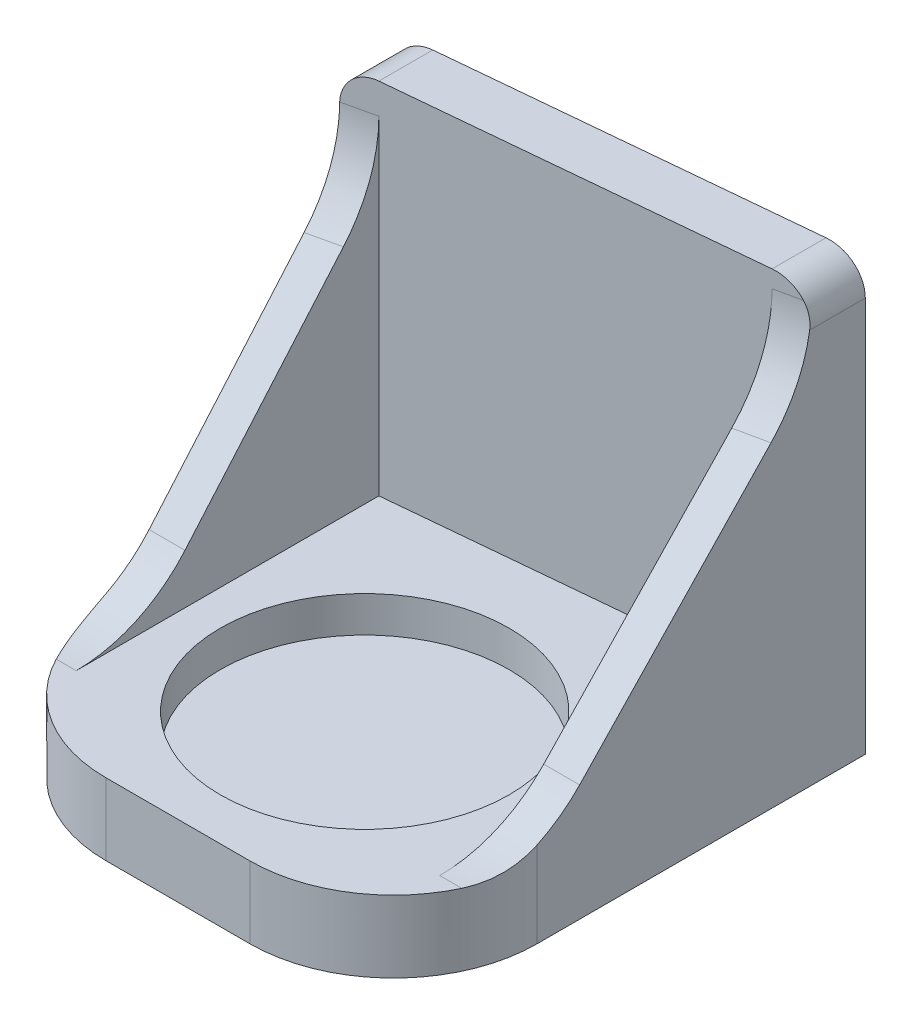
ISO-10303-21;
HEADER;
FILE_DESCRIPTION(('STEP AP214'),'2;1');
FILE_NAME('part.step','',(''),(''),'','','');
FILE_SCHEMA(('AUTOMOTIVE_DESIGN { 1 0 10303 214 1 1 1 1 }'));
ENDSEC;
DATA;
#1=APPLICATION_CONTEXT('core data for automotive mechanical design processes');
#2=APPLICATION_PROTOCOL_DEFINITION('international standard','automotive_design',2000,#1);
#3=PRODUCT_CONTEXT('',#1,'mechanical');
#4=PRODUCT('Part','Part','',(#3));
#5=PRODUCT_RELATED_PRODUCT_CATEGORY('part','',(#4));
#6=PRODUCT_DEFINITION_FORMATION('','',#4);
#7=PRODUCT_DEFINITION_CONTEXT('part definition',#1,'design');
#8=PRODUCT_DEFINITION('design','',#6,#7);
#9=PRODUCT_DEFINITION_SHAPE('','',#8);
#10=(LENGTH_UNIT() NAMED_UNIT(*) SI_UNIT(.MILLI.,.METRE.));
#11=(NAMED_UNIT(*) PLANE_ANGLE_UNIT() SI_UNIT($,.RADIAN.));
#12=(NAMED_UNIT(*) SI_UNIT($,.STERADIAN.) SOLID_ANGLE_UNIT());
#13=UNCERTAINTY_MEASURE_WITH_UNIT(LENGTH_MEASURE(1.E-05),#10,'distance_accuracy_value','');
#14=(GEOMETRIC_REPRESENTATION_CONTEXT(3) GLOBAL_UNCERTAINTY_ASSIGNED_CONTEXT((#13)) GLOBAL_UNIT_ASSIGNED_CONTEXT((#10,
#11,#12)) REPRESENTATION_CONTEXT('',''));
#15=CARTESIAN_POINT('',(0.,0.,0.));
#16=DIRECTION('',(0.,0.,1.));
#17=DIRECTION('',(1.,0.,0.));
#18=AXIS2_PLACEMENT_3D('',#15,#16,#17);
#19=CARTESIAN_POINT('',(19.05,6.35,-22.6515103679304));
#20=DIRECTION('',(0.0941083133185078,0.,0.995561964603081));
#21=DIRECTION('',(0.995561964603081,0.,-0.0941083133185078));
#22=AXIS2_PLACEMENT_3D('',#19,#20,#21);
#23=PLANE('',#22);
#24=DIRECTION('',(-0.99556196460308,0.,0.0941083133185077));
#25=VECTOR('',#24,1.);
#26=CARTESIAN_POINT('',(19.05,38.1,-22.6515103679304));
#27=LINE('',#26,#25);
#28=CARTESIAN_POINT('',(15.875,38.1,-22.3513845039362));
#29=VERTEX_POINT('',#28);
#30=CARTESIAN_POINT('',(-15.875,38.1,-19.3501258639942));
#31=VERTEX_POINT('',#30);
#32=EDGE_CURVE('E167',#29,#31,#27,.T.);
#33=ORIENTED_EDGE('',*,*,#32,.F.);
#34=CARTESIAN_POINT('',(15.875,34.925,-22.3513845039362));
#35=DIRECTION('',(0.0941083133185078,0.,0.995561964603081));
#36=DIRECTION('',(-0.995561964603081,0.,0.0941083133185078));
#37=AXIS2_PLACEMENT_3D('',#34,#35,#36);
#38=ELLIPSE('',#37,3.18915357645853,3.175);
#39=CARTESIAN_POINT('',(19.05,34.925,-22.6515103679304));
#40=VERTEX_POINT('',#39);
#41=EDGE_CURVE('E341',#29,#40,#38,.F.);
#42=ORIENTED_EDGE('',*,*,#41,.T.);
#43=DIRECTION('',(0.,-1.,0.));
#44=VECTOR('',#43,1.);
#45=CARTESIAN_POINT('',(19.05,6.35,-22.6515103679304));
#46=LINE('',#45,#44);
#47=CARTESIAN_POINT('',(19.05,0.,-22.6515103679304));
#48=VERTEX_POINT('',#47);
#49=EDGE_CURVE('E212',#40,#48,#46,.T.);
#50=ORIENTED_EDGE('',*,*,#49,.T.);
#51=DIRECTION('',(-0.99556196460308,0.,0.0941083133185077));
#52=VECTOR('',#51,1.);
#53=CARTESIAN_POINT('',(19.05,0.,-22.6515103679304));
#54=LINE('',#53,#52);
#55=CARTESIAN_POINT('',(-19.05,0.,-19.05));
#56=VERTEX_POINT('',#55);
#57=EDGE_CURVE('E206',#48,#56,#54,.T.);
#58=ORIENTED_EDGE('',*,*,#57,.T.);
#59=DIRECTION('',(0.,-1.,0.));
#60=VECTOR('',#59,1.);
#61=CARTESIAN_POINT('',(-19.05,6.35,-19.05));
#62=LINE('',#61,#60);
#63=CARTESIAN_POINT('',(-19.05,34.925,-19.05));
#64=VERTEX_POINT('',#63);
#65=EDGE_CURVE('E225',#64,#56,#62,.T.);
#66=ORIENTED_EDGE('',*,*,#65,.F.);
#67=CARTESIAN_POINT('',(-15.875,34.925,-19.3501258639942));
#68=DIRECTION('',(0.0941083133185078,0.,0.995561964603081));
#69=DIRECTION('',(0.995561964603081,0.,-0.0941083133185078));
#70=AXIS2_PLACEMENT_3D('',#67,#68,#69);
#71=ELLIPSE('',#70,3.18915357645853,3.175);
#72=EDGE_CURVE('E345',#64,#31,#71,.F.);
#73=ORIENTED_EDGE('',*,*,#72,.T.);
#74=EDGE_LOOP('',(#33,#42,#50,#58,#66,#73));
#75=FACE_BOUND('',#74,.T.);
#76=ADVANCED_FACE('F33',(#75),#23,.F.);
#77=CARTESIAN_POINT('',(-19.05,6.35,-19.05));
#78=DIRECTION('',(1.,0.,0.));
#79=DIRECTION('',(0.,0.,-1.));
#80=AXIS2_PLACEMENT_3D('',#77,#78,#79);
#81=PLANE('',#80);
#82=CARTESIAN_POINT('',(-19.05,34.9321798310049,-1.53088569416586));
#83=DIRECTION('',(1.,0.,0.));
#84=DIRECTION('',(0.,0.757248519517734,-0.653126848084046));
#85=AXIS2_PLACEMENT_3D('',#82,#83,#84);
#86=ELLIPSE('',#85,12.8323248452112,12.7);
#87=CARTESIAN_POINT('',(-19.05,26.6374688603375,-11.1479418920411));
#88=VERTEX_POINT('',#87);
#89=CARTESIAN_POINT('',(-19.05,34.925,-14.2867540013075));
#90=VERTEX_POINT('',#89);
#91=EDGE_CURVE('E354',#88,#90,#86,.T.);
#92=ORIENTED_EDGE('',*,*,#91,.T.);
#93=DIRECTION('',(0.,0.,1.));
#94=VECTOR('',#93,1.);
#95=CARTESIAN_POINT('',(-19.05,34.925,-19.05));
#96=LINE('',#95,#94);
#97=EDGE_CURVE('E11',#90,#64,#96,.F.);
#98=ORIENTED_EDGE('',*,*,#97,.T.);
#99=ORIENTED_EDGE('',*,*,#65,.T.);
#100=DIRECTION('',(0.,0.,1.));
#101=VECTOR('',#100,1.);
#102=CARTESIAN_POINT('',(-19.05,0.,-19.05));
#103=LINE('',#102,#101);
#104=CARTESIAN_POINT('',(-19.05,0.,6.35));
#105=VERTEX_POINT('',#104);
#106=EDGE_CURVE('E216',#56,#105,#103,.T.);
#107=ORIENTED_EDGE('',*,*,#106,.T.);
#108=DIRECTION('',(0.,-1.,0.));
#109=VECTOR('',#108,1.);
#110=CARTESIAN_POINT('',(-19.05,6.35,6.35));
#111=LINE('',#110,#109);
#112=CARTESIAN_POINT('',(-19.05,7.76076801599256,6.35));
#113=VERTEX_POINT('',#112);
#114=EDGE_CURVE('E178',#105,#113,#111,.F.);
#115=ORIENTED_EDGE('',*,*,#114,.T.);
#116=CARTESIAN_POINT('',(-19.05,19.05,12.1674944100758));
#117=DIRECTION('',(1.,0.,0.));
#118=DIRECTION('',(0.,0.,-1.));
#119=AXIS2_PLACEMENT_3D('',#116,#117,#118);
#120=CIRCLE('',#119,12.7);
#121=CARTESIAN_POINT('',(-19.05,10.7552890293326,2.55043821220062));
#122=VERTEX_POINT('',#121);
#123=EDGE_CURVE('E297',#113,#122,#120,.T.);
#124=ORIENTED_EDGE('',*,*,#123,.T.);
#125=DIRECTION('',(0.,0.757248519517734,-0.653126848084046));
#126=VECTOR('',#125,1.);
#127=CARTESIAN_POINT('',(-19.05,31.75,-15.5575));
#128=LINE('',#127,#126);
#129=EDGE_CURVE('E194',#122,#88,#128,.T.);
#130=ORIENTED_EDGE('',*,*,#129,.T.);
#131=EDGE_LOOP('',(#92,#98,#99,#107,#115,#124,#130));
#132=FACE_BOUND('',#131,.T.);
#133=ADVANCED_FACE('F333',(#132),#81,.F.);
#134=CARTESIAN_POINT('',(-19.05,6.35,19.05));
#135=DIRECTION('',(0.,0.,-1.));
#136=DIRECTION('',(-1.,0.,0.));
#137=AXIS2_PLACEMENT_3D('',#134,#135,#136);
#138=PLANE('',#137);
#139=DIRECTION('',(1.,0.,0.));
#140=VECTOR('',#139,1.);
#141=CARTESIAN_POINT('',(-19.05,0.,19.05));
#142=LINE('',#141,#140);
#143=CARTESIAN_POINT('',(-6.35000000000001,0.,19.05));
#144=VERTEX_POINT('',#143);
#145=CARTESIAN_POINT('',(6.34999999999999,0.,19.05));
#146=VERTEX_POINT('',#145);
#147=EDGE_CURVE('E219',#144,#146,#142,.T.);
#148=ORIENTED_EDGE('',*,*,#147,.T.);
#149=DIRECTION('',(0.,-1.,0.));
#150=VECTOR('',#149,1.);
#151=CARTESIAN_POINT('',(6.35,6.35,19.05));
#152=LINE('',#151,#150);
#153=CARTESIAN_POINT('',(6.34999999999999,6.35,19.05));
#154=VERTEX_POINT('',#153);
#155=EDGE_CURVE('E237',#146,#154,#152,.F.);
#156=ORIENTED_EDGE('',*,*,#155,.T.);
#157=DIRECTION('',(1.,0.,0.));
#158=VECTOR('',#157,1.);
#159=CARTESIAN_POINT('',(-19.05,6.35,19.05));
#160=LINE('',#159,#158);
#161=CARTESIAN_POINT('',(-6.35000000000001,6.35,19.05));
#162=VERTEX_POINT('',#161);
#163=EDGE_CURVE('E209',#162,#154,#160,.T.);
#164=ORIENTED_EDGE('',*,*,#163,.F.);
#165=DIRECTION('',(0.,-1.,0.));
#166=VECTOR('',#165,1.);
#167=CARTESIAN_POINT('',(-6.35,6.35,19.05));
#168=LINE('',#167,#166);
#169=EDGE_CURVE('E234',#162,#144,#168,.T.);
#170=ORIENTED_EDGE('',*,*,#169,.T.);
#171=EDGE_LOOP('',(#148,#156,#164,#170));
#172=FACE_BOUND('',#171,.T.);
#173=ADVANCED_FACE('F338',(#172),#138,.F.);
#174=CARTESIAN_POINT('',(19.05,6.35,19.05));
#175=DIRECTION('',(-1.,0.,0.));
#176=DIRECTION('',(0.,0.,1.));
#177=AXIS2_PLACEMENT_3D('',#174,#175,#176);
#178=PLANE('',#177);
#179=ORIENTED_EDGE('',*,*,#49,.F.);
#180=DIRECTION('',(0.,0.,-1.));
#181=VECTOR('',#180,1.);
#182=CARTESIAN_POINT('',(19.05,34.925,-17.8890103679304));
#183=LINE('',#182,#181);
#184=CARTESIAN_POINT('',(19.05,34.925,-17.7360967193134));
#185=VERTEX_POINT('',#184);
#186=EDGE_CURVE('E319',#40,#185,#183,.F.);
#187=ORIENTED_EDGE('',*,*,#186,.T.);
#188=CARTESIAN_POINT('',(19.05,36.778048987197,-5.13239606209626));
#189=DIRECTION('',(-1.,0.,0.));
#190=DIRECTION('',(0.,0.72344721064674,-0.690379702343176));
#191=AXIS2_PLACEMENT_3D('',#188,#189,#190);
#192=ELLIPSE('',#191,12.8184938370346,12.7);
#193=CARTESIAN_POINT('',(19.05,28.0102267674387,-14.3201756373098));
#194=VERTEX_POINT('',#193);
#195=EDGE_CURVE('E365',#185,#194,#192,.T.);
#196=ORIENTED_EDGE('',*,*,#195,.T.);
#197=DIRECTION('',(0.,-0.72344721064674,0.690379702343175));
#198=VECTOR('',#197,1.);
#199=CARTESIAN_POINT('',(19.05,6.35,6.35));
#200=LINE('',#199,#198);
#201=CARTESIAN_POINT('',(19.05,10.2821777802417,2.59755519748727));
#202=VERTEX_POINT('',#201);
#203=EDGE_CURVE('E186',#194,#202,#200,.T.);
#204=ORIENTED_EDGE('',*,*,#203,.T.);
#205=CARTESIAN_POINT('',(19.05,19.05,11.7853347727009));
#206=DIRECTION('',(-1.,0.,0.));
#207=DIRECTION('',(0.,0.,1.));
#208=AXIS2_PLACEMENT_3D('',#205,#206,#207);
#209=CIRCLE('',#208,12.7);
#210=CARTESIAN_POINT('',(19.05,7.57188447920701,6.35));
#211=VERTEX_POINT('',#210);
#212=EDGE_CURVE('E262',#202,#211,#209,.T.);
#213=ORIENTED_EDGE('',*,*,#212,.T.);
#214=DIRECTION('',(0.,-1.,0.));
#215=VECTOR('',#214,1.);
#216=CARTESIAN_POINT('',(19.05,6.35,6.35));
#217=LINE('',#216,#215);
#218=CARTESIAN_POINT('',(19.05,0.,6.35));
#219=VERTEX_POINT('',#218);
#220=EDGE_CURVE('E227',#211,#219,#217,.T.);
#221=ORIENTED_EDGE('',*,*,#220,.T.);
#222=DIRECTION('',(0.,0.,-1.));
#223=VECTOR('',#222,1.);
#224=CARTESIAN_POINT('',(19.05,0.,19.05));
#225=LINE('',#224,#223);
#226=EDGE_CURVE('E213',#219,#48,#225,.T.);
#227=ORIENTED_EDGE('',*,*,#226,.T.);
#228=EDGE_LOOP('',(#179,#187,#196,#204,#213,#221,#227));
#229=FACE_BOUND('',#228,.T.);
#230=ADVANCED_FACE('F364',(#229),#178,.F.);
#231=CARTESIAN_POINT('',(0.,6.35,0.));
#232=DIRECTION('',(0.,1.,0.));
#233=DIRECTION('',(0.,0.,1.));
#234=AXIS2_PLACEMENT_3D('',#231,#232,#233);
#235=PLANE('',#234);
#236=CARTESIAN_POINT('',(6.35,6.35,6.35));
#237=DIRECTION('',(0.,1.,0.));
#238=DIRECTION('',(0.,0.,1.));
#239=AXIS2_PLACEMENT_3D('',#236,#237,#238);
#240=CIRCLE('',#239,12.7);
#241=CARTESIAN_POINT('',(17.828115520793,6.35,11.7853347727009));
#242=VERTEX_POINT('',#241);
#243=EDGE_CURVE('E241',#154,#242,#240,.T.);
#244=ORIENTED_EDGE('',*,*,#243,.T.);
#245=DIRECTION('',(1.,0.,0.));
#246=VECTOR('',#245,1.);
#247=CARTESIAN_POINT('',(15.875,6.35,11.7853347727009));
#248=LINE('',#247,#246);
#249=CARTESIAN_POINT('',(15.875,6.35,11.7853347727009));
#250=VERTEX_POINT('',#249);
#251=EDGE_CURVE('E184',#242,#250,#248,.F.);
#252=ORIENTED_EDGE('',*,*,#251,.T.);
#253=DIRECTION('',(0.,0.,-1.));
#254=VECTOR('',#253,1.);
#255=CARTESIAN_POINT('',(15.875,6.35,-17.8890103679304));
#256=LINE('',#255,#254);
#257=CARTESIAN_POINT('',(15.875,6.35,-17.5888845039362));
#258=VERTEX_POINT('',#257);
#259=EDGE_CURVE('E173',#250,#258,#256,.T.);
#260=ORIENTED_EDGE('',*,*,#259,.T.);
#261=DIRECTION('',(0.99556196460308,0.,-0.0941083133185079));
#262=VECTOR('',#261,1.);
#263=CARTESIAN_POINT('',(-19.05,6.35,-14.2875));
#264=LINE('',#263,#262);
#265=CARTESIAN_POINT('',(-15.875,6.35,-14.5876258639942));
#266=VERTEX_POINT('',#265);
#267=EDGE_CURVE('E156',#266,#258,#264,.T.);
#268=ORIENTED_EDGE('',*,*,#267,.F.);
#269=DIRECTION('',(0.,0.,1.));
#270=VECTOR('',#269,1.);
#271=CARTESIAN_POINT('',(-15.875,6.35,6.35));
#272=LINE('',#271,#270);
#273=CARTESIAN_POINT('',(-15.875,6.35,12.1674944100758));
#274=VERTEX_POINT('',#273);
#275=EDGE_CURVE('E391',#266,#274,#272,.T.);
#276=ORIENTED_EDGE('',*,*,#275,.T.);
#277=DIRECTION('',(-1.,0.,0.));
#278=VECTOR('',#277,1.);
#279=CARTESIAN_POINT('',(-19.05,6.35,12.1674944100758));
#280=LINE('',#279,#278);
#281=CARTESIAN_POINT('',(-17.6392319840074,6.35,12.1674944100758));
#282=VERTEX_POINT('',#281);
#283=EDGE_CURVE('E250',#274,#282,#280,.T.);
#284=ORIENTED_EDGE('',*,*,#283,.T.);
#285=CARTESIAN_POINT('',(-6.35,6.35,6.35));
#286=DIRECTION('',(0.,1.,0.));
#287=DIRECTION('',(0.,0.,1.));
#288=AXIS2_PLACEMENT_3D('',#285,#286,#287);
#289=CIRCLE('',#288,12.7);
#290=EDGE_CURVE('E239',#282,#162,#289,.T.);
#291=ORIENTED_EDGE('',*,*,#290,.T.);
#292=ORIENTED_EDGE('',*,*,#163,.T.);
#293=EDGE_LOOP('',(#244,#252,#260,#268,#276,#284,#291,#292));
#294=FACE_BOUND('',#293,.T.);
#295=CARTESIAN_POINT('',(0.,6.35,2.54));
#296=DIRECTION('',(0.,1.,0.));
#297=DIRECTION('',(0.,0.,1.));
#298=AXIS2_PLACEMENT_3D('',#295,#296,#297);
#299=CIRCLE('',#298,12.7635);
#300=CARTESIAN_POINT('',(0.,6.35,15.3035));
#301=VERTEX_POINT('',#300);
#302=EDGE_CURVE('E201',#301,#301,#299,.T.);
#303=ORIENTED_EDGE('',*,*,#302,.F.);
#304=EDGE_LOOP('',(#303));
#305=FACE_BOUND('',#304,.T.);
#306=ADVANCED_FACE('F181',(#294,#305),#235,.T.);
#307=CARTESIAN_POINT('',(0.,0.,0.));
#308=DIRECTION('',(0.,1.,0.));
#309=DIRECTION('',(0.,0.,1.));
#310=AXIS2_PLACEMENT_3D('',#307,#308,#309);
#311=PLANE('',#310);
#312=ORIENTED_EDGE('',*,*,#226,.F.);
#313=CARTESIAN_POINT('',(6.35,0.,6.35));
#314=DIRECTION('',(0.,1.,0.));
#315=DIRECTION('',(0.,0.,1.));
#316=AXIS2_PLACEMENT_3D('',#313,#314,#315);
#317=CIRCLE('',#316,12.7);
#318=EDGE_CURVE('E232',#219,#146,#317,.F.);
#319=ORIENTED_EDGE('',*,*,#318,.T.);
#320=ORIENTED_EDGE('',*,*,#147,.F.);
#321=CARTESIAN_POINT('',(-6.35,0.,6.35));
#322=DIRECTION('',(0.,1.,0.));
#323=DIRECTION('',(0.,0.,1.));
#324=AXIS2_PLACEMENT_3D('',#321,#322,#323);
#325=CIRCLE('',#324,12.7);
#326=EDGE_CURVE('E230',#144,#105,#325,.F.);
#327=ORIENTED_EDGE('',*,*,#326,.T.);
#328=ORIENTED_EDGE('',*,*,#106,.F.);
#329=ORIENTED_EDGE('',*,*,#57,.F.);
#330=EDGE_LOOP('',(#312,#319,#320,#327,#328,#329));
#331=FACE_BOUND('',#330,.T.);
#332=ADVANCED_FACE('F400',(#331),#311,.F.);
#333=CARTESIAN_POINT('',(0.,3.175,2.54));
#334=DIRECTION('',(0.,1.,0.));
#335=DIRECTION('',(0.,0.,1.));
#336=AXIS2_PLACEMENT_3D('',#333,#334,#335);
#337=CYLINDRICAL_SURFACE('',#336,12.7635);
#338=CARTESIAN_POINT('',(0.,3.175,2.54));
#339=DIRECTION('',(0.,1.,0.));
#340=DIRECTION('',(0.,0.,1.));
#341=AXIS2_PLACEMENT_3D('',#338,#339,#340);
#342=CIRCLE('',#341,12.7635);
#343=CARTESIAN_POINT('',(0.,3.175,15.3035));
#344=VERTEX_POINT('',#343);
#345=EDGE_CURVE('E203',#344,#344,#342,.T.);
#346=ORIENTED_EDGE('',*,*,#345,.F.);
#347=EDGE_LOOP('',(#346));
#348=FACE_BOUND('',#347,.T.);
#349=ORIENTED_EDGE('',*,*,#302,.T.);
#350=EDGE_LOOP('',(#349));
#351=FACE_BOUND('',#350,.T.);
#352=ADVANCED_FACE('F427',(#348,#351),#337,.F.);
#353=CARTESIAN_POINT('',(0.,3.175,2.54));
#354=DIRECTION('',(0.,1.,0.));
#355=DIRECTION('',(0.,0.,1.));
#356=AXIS2_PLACEMENT_3D('',#353,#354,#355);
#357=PLANE('',#356);
#358=ORIENTED_EDGE('',*,*,#345,.T.);
#359=EDGE_LOOP('',(#358));
#360=FACE_BOUND('',#359,.T.);
#361=ADVANCED_FACE('F424',(#360),#357,.T.);
#362=CARTESIAN_POINT('',(-19.05,38.1,-14.2875));
#363=DIRECTION('',(-0.0941083133185079,0.,-0.995561964603081));
#364=DIRECTION('',(-0.995561964603081,0.,0.0941083133185079));
#365=AXIS2_PLACEMENT_3D('',#362,#363,#364);
#366=PLANE('',#365);
#367=DIRECTION('',(0.990756024963537,0.0981398179170067,-0.0936540182676033));
#368=VECTOR('',#367,1.);
#369=CARTESIAN_POINT('',(-18.5660172384416,33.1703648765109,-14.3332498407783));
#370=LINE('',#369,#368);
#371=CARTESIAN_POINT('',(15.875,36.5819365202781,-17.5888845039362));
#372=VERTEX_POINT('',#371);
#373=CARTESIAN_POINT('',(18.4125272770952,36.8332925137405,-17.8287514539983));
#374=VERTEX_POINT('',#373);
#375=EDGE_CURVE('E260',#372,#374,#370,.T.);
#376=ORIENTED_EDGE('',*,*,#375,.T.);
#377=CARTESIAN_POINT('',(15.875,34.925,-17.5888845039362));
#378=DIRECTION('',(-0.0941083133185079,0.,-0.995561964603081));
#379=DIRECTION('',(-0.995561964603081,0.,0.0941083133185079));
#380=AXIS2_PLACEMENT_3D('',#377,#378,#379);
#381=ELLIPSE('',#380,3.18915357645854,3.175);
#382=CARTESIAN_POINT('',(15.875,38.1,-17.5888845039362));
#383=VERTEX_POINT('',#382);
#384=EDGE_CURVE('E371',#374,#383,#381,.F.);
#385=ORIENTED_EDGE('',*,*,#384,.T.);
#386=DIRECTION('',(0.99556196460308,0.,-0.0941083133185079));
#387=VECTOR('',#386,1.);
#388=CARTESIAN_POINT('',(-19.05,38.1,-14.2875));
#389=LINE('',#388,#387);
#390=CARTESIAN_POINT('',(-15.875,38.1,-14.5876258639942));
#391=VERTEX_POINT('',#390);
#392=EDGE_CURVE('E199',#391,#383,#389,.T.);
#393=ORIENTED_EDGE('',*,*,#392,.F.);
#394=CARTESIAN_POINT('',(-15.875,34.925,-14.5876258639942));
#395=DIRECTION('',(-0.0941083133185079,0.,-0.995561964603081));
#396=DIRECTION('',(0.995561964603081,0.,-0.0941083133185079));
#397=AXIS2_PLACEMENT_3D('',#394,#395,#396);
#398=ELLIPSE('',#397,3.18915357645854,3.175);
#399=CARTESIAN_POINT('',(-19.0469777654224,35.0634992984309,-14.2877856852799));
#400=VERTEX_POINT('',#399);
#401=EDGE_CURVE('E56',#391,#400,#398,.F.);
#402=ORIENTED_EDGE('',*,*,#401,.T.);
#403=DIRECTION('',(0.989688162760266,0.108467333993658,-0.0935530755695298));
#404=VECTOR('',#403,1.);
#405=CARTESIAN_POINT('',(-18.723999625575,35.0988968904055,-14.318316108358));
#406=LINE('',#405,#404);
#407=CARTESIAN_POINT('',(-15.875,35.411140085346,-14.5876258639942));
#408=VERTEX_POINT('',#407);
#409=EDGE_CURVE('E258',#400,#408,#406,.T.);
#410=ORIENTED_EDGE('',*,*,#409,.T.);
#411=DIRECTION('',(0.,1.,0.));
#412=VECTOR('',#411,1.);
#413=CARTESIAN_POINT('',(-15.875,38.1,-14.5876258639942));
#414=LINE('',#413,#412);
#415=EDGE_CURVE('E163',#266,#408,#414,.T.);
#416=ORIENTED_EDGE('',*,*,#415,.F.);
#417=ORIENTED_EDGE('',*,*,#267,.T.);
#418=DIRECTION('',(0.,-1.,0.));
#419=VECTOR('',#418,1.);
#420=CARTESIAN_POINT('',(15.875,38.1,-17.5888845039362));
#421=LINE('',#420,#419);
#422=EDGE_CURVE('E160',#372,#258,#421,.T.);
#423=ORIENTED_EDGE('',*,*,#422,.F.);
#424=EDGE_LOOP('',(#376,#385,#393,#402,#410,#416,#417,#423));
#425=FACE_BOUND('',#424,.T.);
#426=ADVANCED_FACE('F159',(#425),#366,.F.);
#427=CARTESIAN_POINT('',(0.,38.1,0.));
#428=DIRECTION('',(0.,1.,0.));
#429=DIRECTION('',(0.,0.,1.));
#430=AXIS2_PLACEMENT_3D('',#427,#428,#429);
#431=PLANE('',#430);
#432=ORIENTED_EDGE('',*,*,#392,.T.);
#433=DIRECTION('',(0.,0.,-1.));
#434=VECTOR('',#433,1.);
#435=CARTESIAN_POINT('',(15.875,38.1,-22.6515103679304));
#436=LINE('',#435,#434);
#437=EDGE_CURVE('E352',#383,#29,#436,.T.);
#438=ORIENTED_EDGE('',*,*,#437,.T.);
#439=ORIENTED_EDGE('',*,*,#32,.T.);
#440=DIRECTION('',(0.,0.,1.));
#441=VECTOR('',#440,1.);
#442=CARTESIAN_POINT('',(-15.875,38.1,-14.2875));
#443=LINE('',#442,#441);
#444=EDGE_CURVE('E350',#31,#391,#443,.T.);
#445=ORIENTED_EDGE('',*,*,#444,.T.);
#446=EDGE_LOOP('',(#432,#438,#439,#445));
#447=FACE_BOUND('',#446,.T.);
#448=ADVANCED_FACE('F284',(#447),#431,.T.);
#449=CARTESIAN_POINT('',(6.35,6.35,6.35));
#450=DIRECTION('',(0.,-1.,0.));
#451=DIRECTION('',(0.,0.,-1.));
#452=AXIS2_PLACEMENT_3D('',#449,#450,#451);
#453=CYLINDRICAL_SURFACE('',#452,12.7);
#454=ORIENTED_EDGE('',*,*,#243,.F.);
#455=ORIENTED_EDGE('',*,*,#155,.F.);
#456=ORIENTED_EDGE('',*,*,#318,.F.);
#457=ORIENTED_EDGE('',*,*,#220,.F.);
#458=CARTESIAN_POINT('',(19.05,7.57188447920701,6.35));
#459=CARTESIAN_POINT('',(19.0500006754498,7.51453666705002,6.47110249252628));
#460=CARTESIAN_POINT('',(19.0482672656894,7.45911354176519,6.59310137224601));
#461=CARTESIAN_POINT('',(19.0411882468671,7.35218603709664,6.838710609565));
#462=CARTESIAN_POINT('',(19.0358423852725,7.30068193195644,6.96232107923174));
#463=CARTESIAN_POINT('',(19.0141688488675,7.15215323810756,7.33529893482078));
#464=CARTESIAN_POINT('',(18.9922051604846,7.0611245990008,7.58678671914194));
#465=CARTESIAN_POINT('',(18.9331472383635,6.897736467846,8.08670253549254));
#466=CARTESIAN_POINT('',(18.8964589157695,6.82495511138338,8.33504154512901));
#467=CARTESIAN_POINT('',(18.807472837038,6.69524917891004,8.83300018848076));
#468=CARTESIAN_POINT('',(18.7551801454299,6.63831946968491,9.08261938090714));
#469=CARTESIAN_POINT('',(18.6451484550816,6.54862071642905,9.53816633429238));
#470=CARTESIAN_POINT('',(18.5898973943565,6.51337943885136,9.74421682020977));
#471=CARTESIAN_POINT('',(18.4685913370148,6.45341464126009,10.1546738390333));
#472=CARTESIAN_POINT('',(18.4025360310527,6.42869142247095,10.3590803246928));
#473=CARTESIAN_POINT('',(18.2582151932734,6.38897006388008,10.7695863251752));
#474=CARTESIAN_POINT('',(18.1797132499854,6.37419755982149,10.9756243442008));
#475=CARTESIAN_POINT('',(18.0119240582319,6.35470280539611,11.3837222455959));
#476=CARTESIAN_POINT('',(17.9226380662481,6.34997938537207,11.585782588232));
#477=CARTESIAN_POINT('',(17.828115520793,6.35,11.7853347727009));
#478=B_SPLINE_CURVE_WITH_KNOTS('',3,(#458,#459,#460,#461,#462,#463,#464,#465,#466,#467,#468,
#469,#470,#471,#472,#473,#474,#475,#476,#477),.UNSPECIFIED.,.F.,.F.,(4,2,2,2,2,2,2,2,2,4),(0.,
0.401926857474098,0.803881814998254,1.60787791124483,2.39108527555482,3.17403871928543,
3.82218570251227,4.47035124663362,5.13275952563954,5.79509069980208),.UNSPECIFIED.);
#479=EDGE_CURVE('E265',#211,#242,#478,.T.);
#480=ORIENTED_EDGE('',*,*,#479,.T.);
#481=EDGE_LOOP('',(#454,#455,#456,#457,#480));
#482=FACE_BOUND('',#481,.T.);
#483=ADVANCED_FACE('F279',(#482),#453,.T.);
#484=CARTESIAN_POINT('',(-6.35,6.35,6.35));
#485=DIRECTION('',(0.,-1.,0.));
#486=DIRECTION('',(0.,0.,-1.));
#487=AXIS2_PLACEMENT_3D('',#484,#485,#486);
#488=CYLINDRICAL_SURFACE('',#487,12.7);
#489=ORIENTED_EDGE('',*,*,#290,.F.);
#490=CARTESIAN_POINT('',(-17.6392319840074,6.35,12.1674944100758));
#491=CARTESIAN_POINT('',(-17.7011029828151,6.3499993882147,12.0474317036286));
#492=CARTESIAN_POINT('',(-17.7610503154654,6.35170309857119,11.9263927425588));
#493=CARTESIAN_POINT('',(-17.8770221664167,6.35867611418238,11.6825407899303));
#494=CARTESIAN_POINT('',(-17.9330463931959,6.36394568410268,11.5597276673519));
#495=CARTESIAN_POINT('',(-18.0951176323867,6.38533957797676,11.1888993302958));
#496=CARTESIAN_POINT('',(-18.1951519299258,6.40704914322599,10.9385170351403));
#497=CARTESIAN_POINT('',(-18.3760131187207,6.46552475521971,10.4406265454055));
#498=CARTESIAN_POINT('',(-18.457297140903,6.50185488681163,10.1932323416732));
#499=CARTESIAN_POINT('',(-18.6038800656564,6.59014267882303,9.69655521609426));
#500=CARTESIAN_POINT('',(-18.6691831057382,6.64209628651049,9.44727280037744));
#501=CARTESIAN_POINT('',(-18.7816116471617,6.75958373486584,8.95871174290129));
#502=CARTESIAN_POINT('',(-18.8293519718738,6.82450186070688,8.71942593010515));
#503=CARTESIAN_POINT('',(-18.9104797936065,6.96906259291607,8.24282994769353));
#504=CARTESIAN_POINT('',(-18.9438646226097,7.04870793245671,8.00552015335762));
#505=CARTESIAN_POINT('',(-18.9975671379602,7.2248716451961,7.52823390559128));
#506=CARTESIAN_POINT('',(-19.017500171649,7.3217938444522,7.28836362565644));
#507=CARTESIAN_POINT('',(-19.0437338089732,7.53036663503397,6.81442320973403));
#508=CARTESIAN_POINT('',(-19.0500382836657,7.64201303453409,6.58035144541394));
#509=CARTESIAN_POINT('',(-19.05,7.76076801599256,6.35));
#510=B_SPLINE_CURVE_WITH_KNOTS('',3,(#490,#491,#492,#493,#494,#495,#496,#497,#498,#499,#500,
#501,#502,#503,#504,#505,#506,#507,#508,#509),.UNSPECIFIED.,.F.,.F.,(4,2,2,2,2,2,2,2,2,4),(0.,
0.405143816804255,0.810317707534346,1.62073912092724,2.40860256906022,3.19626182133043,
3.95288716781558,4.70965307496363,5.48723303835748,6.26459210882502),.UNSPECIFIED.);
#511=EDGE_CURVE('E290',#282,#113,#510,.T.);
#512=ORIENTED_EDGE('',*,*,#511,.T.);
#513=ORIENTED_EDGE('',*,*,#114,.F.);
#514=ORIENTED_EDGE('',*,*,#326,.F.);
#515=ORIENTED_EDGE('',*,*,#169,.F.);
#516=EDGE_LOOP('',(#489,#512,#513,#514,#515));
#517=FACE_BOUND('',#516,.T.);
#518=ADVANCED_FACE('F283',(#517),#488,.T.);
#519=CARTESIAN_POINT('',(15.875,0.,0.));
#520=DIRECTION('',(1.,0.,0.));
#521=DIRECTION('',(0.,0.,-1.));
#522=AXIS2_PLACEMENT_3D('',#519,#520,#521);
#523=PLANE('',#522);
#524=DIRECTION('',(0.,-0.72344721064674,0.690379702343175));
#525=VECTOR('',#524,1.);
#526=CARTESIAN_POINT('',(15.875,6.35,6.35));
#527=LINE('',#526,#525);
#528=CARTESIAN_POINT('',(15.875,27.6957256046545,-14.0200497733156));
#529=VERTEX_POINT('',#528);
#530=CARTESIAN_POINT('',(15.875,10.2821777802417,2.59755519748727));
#531=VERTEX_POINT('',#530);
#532=EDGE_CURVE('E168',#529,#531,#527,.T.);
#533=ORIENTED_EDGE('',*,*,#532,.F.);
#534=CARTESIAN_POINT('',(15.875,36.4635478244128,-4.83227019810206));
#535=DIRECTION('',(1.,0.,0.));
#536=DIRECTION('',(0.,0.72344721064674,-0.690379702343175));
#537=AXIS2_PLACEMENT_3D('',#534,#535,#536);
#538=ELLIPSE('',#537,12.8184938370346,12.7);
#539=EDGE_CURVE('E176',#529,#372,#538,.T.);
#540=ORIENTED_EDGE('',*,*,#539,.T.);
#541=ORIENTED_EDGE('',*,*,#422,.T.);
#542=ORIENTED_EDGE('',*,*,#259,.F.);
#543=CARTESIAN_POINT('',(15.875,19.05,11.7853347727009));
#544=DIRECTION('',(1.,0.,0.));
#545=DIRECTION('',(0.,0.,-1.));
#546=AXIS2_PLACEMENT_3D('',#543,#544,#545);
#547=CIRCLE('',#546,12.7);
#548=EDGE_CURVE('E273',#250,#531,#547,.T.);
#549=ORIENTED_EDGE('',*,*,#548,.T.);
#550=EDGE_LOOP('',(#533,#540,#541,#542,#549));
#551=FACE_BOUND('',#550,.T.);
#552=ADVANCED_FACE('F172',(#551),#523,.F.);
#553=CARTESIAN_POINT('',(15.875,6.35,6.35));
#554=DIRECTION('',(0.,0.690379702343175,0.72344721064674));
#555=DIRECTION('',(0.,-0.72344721064674,0.690379702343176));
#556=AXIS2_PLACEMENT_3D('',#553,#554,#555);
#557=PLANE('',#556);
#558=ORIENTED_EDGE('',*,*,#532,.T.);
#559=DIRECTION('',(1.,0.,0.));
#560=VECTOR('',#559,1.);
#561=CARTESIAN_POINT('',(19.05,10.2821777802417,2.59755519748727));
#562=LINE('',#561,#560);
#563=EDGE_CURVE('E247',#531,#202,#562,.T.);
#564=ORIENTED_EDGE('',*,*,#563,.T.);
#565=ORIENTED_EDGE('',*,*,#203,.F.);
#566=DIRECTION('',(0.990756024963537,0.0981398179170067,-0.0936540182676033));
#567=VECTOR('',#566,1.);
#568=CARTESIAN_POINT('',(11.9093973211348,27.3029109105936,-13.6451899527638));
#569=LINE('',#568,#567);
#570=EDGE_CURVE('E245',#194,#529,#569,.F.);
#571=ORIENTED_EDGE('',*,*,#570,.T.);
#572=EDGE_LOOP('',(#558,#564,#565,#571));
#573=FACE_BOUND('',#572,.T.);
#574=ADVANCED_FACE('F408',(#573),#557,.T.);
#575=CARTESIAN_POINT('',(-15.875,0.,0.));
#576=DIRECTION('',(-1.,0.,0.));
#577=DIRECTION('',(0.,0.,1.));
#578=AXIS2_PLACEMENT_3D('',#575,#576,#577);
#579=PLANE('',#578);
#580=ORIENTED_EDGE('',*,*,#275,.F.);
#581=ORIENTED_EDGE('',*,*,#415,.T.);
#582=CARTESIAN_POINT('',(-15.875,35.28015184723,-1.83101155816006));
#583=DIRECTION('',(-1.,0.,0.));
#584=DIRECTION('',(0.,0.757248519517734,-0.653126848084046));
#585=AXIS2_PLACEMENT_3D('',#582,#583,#584);
#586=ELLIPSE('',#585,12.8323248452112,12.7);
#587=CARTESIAN_POINT('',(-15.875,26.9854408765626,-11.4480677560353));
#588=VERTEX_POINT('',#587);
#589=EDGE_CURVE('E357',#408,#588,#586,.T.);
#590=ORIENTED_EDGE('',*,*,#589,.T.);
#591=DIRECTION('',(0.,0.757248519517734,-0.653126848084046));
#592=VECTOR('',#591,1.);
#593=CARTESIAN_POINT('',(-15.875,31.75,-15.5575));
#594=LINE('',#593,#592);
#595=CARTESIAN_POINT('',(-15.875,10.7552890293326,2.55043821220062));
#596=VERTEX_POINT('',#595);
#597=EDGE_CURVE('E191',#596,#588,#594,.T.);
#598=ORIENTED_EDGE('',*,*,#597,.F.);
#599=CARTESIAN_POINT('',(-15.875,19.05,12.1674944100758));
#600=DIRECTION('',(-1.,0.,0.));
#601=DIRECTION('',(0.,0.,1.));
#602=AXIS2_PLACEMENT_3D('',#599,#600,#601);
#603=CIRCLE('',#602,12.7);
#604=EDGE_CURVE('E368',#596,#274,#603,.T.);
#605=ORIENTED_EDGE('',*,*,#604,.T.);
#606=EDGE_LOOP('',(#580,#581,#590,#598,#605));
#607=FACE_BOUND('',#606,.T.);
#608=ADVANCED_FACE('F410',(#607),#579,.F.);
#609=CARTESIAN_POINT('',(-15.875,31.75,-15.5575));
#610=DIRECTION('',(0.,0.653126848084046,0.757248519517734));
#611=DIRECTION('',(0.,-0.757248519517734,0.653126848084046));
#612=AXIS2_PLACEMENT_3D('',#609,#610,#611);
#613=PLANE('',#612);
#614=ORIENTED_EDGE('',*,*,#129,.F.);
#615=DIRECTION('',(-1.,0.,0.));
#616=VECTOR('',#615,1.);
#617=CARTESIAN_POINT('',(-15.875,10.7552890293326,2.55043821220062));
#618=LINE('',#617,#616);
#619=EDGE_CURVE('E256',#122,#596,#618,.F.);
#620=ORIENTED_EDGE('',*,*,#619,.T.);
#621=ORIENTED_EDGE('',*,*,#597,.T.);
#622=DIRECTION('',(0.989688162760266,0.108467333993658,-0.0935530755695298));
#623=VECTOR('',#622,1.);
#624=CARTESIAN_POINT('',(-14.9830444824849,27.0831969583935,-11.5323823766144));
#625=LINE('',#624,#623);
#626=EDGE_CURVE('E254',#588,#88,#625,.F.);
#627=ORIENTED_EDGE('',*,*,#626,.T.);
#628=EDGE_LOOP('',(#614,#620,#621,#627));
#629=FACE_BOUND('',#628,.T.);
#630=ADVANCED_FACE('F388',(#629),#613,.T.);
#631=CARTESIAN_POINT('',(15.875,19.05,11.7853347727009));
#632=DIRECTION('',(-1.,0.,0.));
#633=DIRECTION('',(0.,0.,1.));
#634=AXIS2_PLACEMENT_3D('',#631,#632,#633);
#635=CYLINDRICAL_SURFACE('',#634,12.7);
#636=ORIENTED_EDGE('',*,*,#548,.F.);
#637=ORIENTED_EDGE('',*,*,#251,.F.);
#638=ORIENTED_EDGE('',*,*,#479,.F.);
#639=ORIENTED_EDGE('',*,*,#212,.F.);
#640=ORIENTED_EDGE('',*,*,#563,.F.);
#641=EDGE_LOOP('',(#636,#637,#638,#639,#640));
#642=FACE_BOUND('',#641,.T.);
#643=ADVANCED_FACE('F275',(#642),#635,.F.);
#644=CARTESIAN_POINT('',(0.,19.05,12.1674944100758));
#645=DIRECTION('',(1.,0.,0.));
#646=DIRECTION('',(0.,0.,-1.));
#647=AXIS2_PLACEMENT_3D('',#644,#645,#646);
#648=CYLINDRICAL_SURFACE('',#647,12.7);
#649=ORIENTED_EDGE('',*,*,#604,.F.);
#650=ORIENTED_EDGE('',*,*,#619,.F.);
#651=ORIENTED_EDGE('',*,*,#123,.F.);
#652=ORIENTED_EDGE('',*,*,#511,.F.);
#653=ORIENTED_EDGE('',*,*,#283,.F.);
#654=EDGE_LOOP('',(#649,#650,#651,#652,#653));
#655=FACE_BOUND('',#654,.T.);
#656=ADVANCED_FACE('F299',(#655),#648,.F.);
#657=CARTESIAN_POINT('',(-17.3708416592965,33.1703648765109,-1.68961289031915));
#658=DIRECTION('',(0.990756024963537,0.0981398179170067,-0.0936540182676033));
#659=DIRECTION('',(-0.0985730659058219,0.995129815992831,0.));
#660=AXIS2_PLACEMENT_3D('',#657,#658,#659);
#661=CYLINDRICAL_SURFACE('',#660,12.7);
#662=ORIENTED_EDGE('',*,*,#195,.F.);
#663=CARTESIAN_POINT('',(19.05,34.925,-17.7360967193134));
#664=CARTESIAN_POINT('',(19.0500117260329,35.0102606404106,-17.7494035123289));
#665=CARTESIAN_POINT('',(19.0465660148733,35.0957062617654,-17.7615665166746));
#666=CARTESIAN_POINT('',(19.0327548910533,35.2663453649356,-17.7835217619102));
#667=CARTESIAN_POINT('',(19.0223891890551,35.3515388360586,-17.7933139036466));
#668=CARTESIAN_POINT('',(18.9951186328089,35.518682288654,-17.8102044197561));
#669=CARTESIAN_POINT('',(18.9784040723866,35.6006564940679,-17.8173702623697));
#670=CARTESIAN_POINT('',(18.9385070353439,35.7631821332818,-17.8293674537638));
#671=CARTESIAN_POINT('',(18.9153251502068,35.8437336964767,-17.8341990159205));
#672=CARTESIAN_POINT('',(18.8623431599808,36.0036935331426,-17.8415995299091));
#673=CARTESIAN_POINT('',(18.8324751128632,36.0830804534303,-17.8441438031982));
#674=CARTESIAN_POINT('',(18.7664628764199,36.2392513200098,-17.8469658846114));
#675=CARTESIAN_POINT('',(18.7303179790086,36.31603497146,-17.8472434368589));
#676=CARTESIAN_POINT('',(18.6508705441849,36.4686237069093,-17.8456365343175));
#677=CARTESIAN_POINT('',(18.6073909132023,36.5443359233742,-17.8436891823837));
#678=CARTESIAN_POINT('',(18.5143987451743,36.6918678306146,-17.8377242430977));
#679=CARTESIAN_POINT('',(18.4648866144593,36.7636877830906,-17.8337067951219));
#680=CARTESIAN_POINT('',(18.4125272770951,36.8332925137405,-17.8287514539983));
#681=B_SPLINE_CURVE_WITH_KNOTS('',3,(#663,#664,#665,#666,#667,#668,#669,#670,#671,#672,#673,
#674,#675,#676,#677,#678,#679,#680),.UNSPECIFIED.,.F.,.F.,(4,2,2,2,2,2,2,2,4),(0.,
0.258811909827284,0.517634641746076,0.769244121258824,1.02083059681993,1.27510005612549,
1.52939821798475,1.79106700085519,2.05271816825961),.UNSPECIFIED.);
#682=EDGE_CURVE('E312',#185,#374,#681,.T.);
#683=ORIENTED_EDGE('',*,*,#682,.T.);
#684=ORIENTED_EDGE('',*,*,#375,.F.);
#685=ORIENTED_EDGE('',*,*,#539,.F.);
#686=ORIENTED_EDGE('',*,*,#570,.F.);
#687=EDGE_LOOP('',(#662,#683,#684,#685,#686));
#688=FACE_BOUND('',#687,.T.);
#689=ADVANCED_FACE('F303',(#688),#661,.F.);
#690=CARTESIAN_POINT('',(-17.52882404643,35.0988968904055,-1.6746791578989));
#691=DIRECTION('',(0.989688162760266,0.108467333993658,-0.0935530755695298));
#692=DIRECTION('',(-0.108945135347427,0.994047764186476,0.));
#693=AXIS2_PLACEMENT_3D('',#690,#691,#692);
#694=CYLINDRICAL_SURFACE('',#693,12.7);
#695=ORIENTED_EDGE('',*,*,#409,.F.);
#696=CARTESIAN_POINT('',(-19.0469777654224,35.0634992984309,-14.2877856852799));
#697=CARTESIAN_POINT('',(-19.0479851295224,35.0404264983829,-14.2876908114447));
#698=CARTESIAN_POINT('',(-19.0487406644538,35.0173484901563,-14.2875574008627));
#699=CARTESIAN_POINT('',(-19.0497480759797,34.971182057346,-14.2872135062052));
#700=CARTESIAN_POINT('',(-19.0499999525741,34.9480936327623,-14.2870030221297));
#701=CARTESIAN_POINT('',(-19.05,34.925,-14.2867540013075));
#702=B_SPLINE_CURVE_WITH_KNOTS('',3,(#696,#697,#698,#699,#700,#701),.UNSPECIFIED.,.F.,.F.,(4,2,
4),(0.,0.0692722733574036,0.138544546714794),.UNSPECIFIED.);
#703=EDGE_CURVE('E42',#400,#90,#702,.T.);
#704=ORIENTED_EDGE('',*,*,#703,.T.);
#705=ORIENTED_EDGE('',*,*,#91,.F.);
#706=ORIENTED_EDGE('',*,*,#626,.F.);
#707=ORIENTED_EDGE('',*,*,#589,.F.);
#708=EDGE_LOOP('',(#695,#704,#705,#706,#707));
#709=FACE_BOUND('',#708,.T.);
#710=ADVANCED_FACE('F308',(#709),#694,.F.);
#711=CARTESIAN_POINT('',(15.875,34.925,0.));
#712=DIRECTION('',(0.,0.,1.));
#713=DIRECTION('',(1.,0.,0.));
#714=AXIS2_PLACEMENT_3D('',#711,#712,#713);
#715=CYLINDRICAL_SURFACE('',#714,3.175);
#716=ORIENTED_EDGE('',*,*,#682,.F.);
#717=ORIENTED_EDGE('',*,*,#186,.F.);
#718=ORIENTED_EDGE('',*,*,#41,.F.);
#719=ORIENTED_EDGE('',*,*,#437,.F.);
#720=ORIENTED_EDGE('',*,*,#384,.F.);
#721=EDGE_LOOP('',(#716,#717,#718,#719,#720));
#722=FACE_BOUND('',#721,.T.);
#723=ADVANCED_FACE('F322',(#722),#715,.T.);
#724=CARTESIAN_POINT('',(-15.875,34.925,0.));
#725=DIRECTION('',(0.,0.,-1.));
#726=DIRECTION('',(-1.,0.,0.));
#727=AXIS2_PLACEMENT_3D('',#724,#725,#726);
#728=CYLINDRICAL_SURFACE('',#727,3.175);
#729=ORIENTED_EDGE('',*,*,#72,.F.);
#730=ORIENTED_EDGE('',*,*,#97,.F.);
#731=ORIENTED_EDGE('',*,*,#703,.F.);
#732=ORIENTED_EDGE('',*,*,#401,.F.);
#733=ORIENTED_EDGE('',*,*,#444,.F.);
#734=EDGE_LOOP('',(#729,#730,#731,#732,#733));
#735=FACE_BOUND('',#734,.T.);
#736=ADVANCED_FACE('F35',(#735),#728,.T.);
#737=CLOSED_SHELL('',(#76,#133,#173,#230,#306,#332,#352,#361,#426,#448,#483,#518,#552,#574,#608,
#630,#643,#656,#689,#710,#723,#736));
#738=MANIFOLD_SOLID_BREP('B2',#737);
#739=ADVANCED_BREP_SHAPE_REPRESENTATION('',(#18,#738),#14);
#740=SHAPE_DEFINITION_REPRESENTATION(#9,#739);
ENDSEC;
END-ISO-10303-21;
